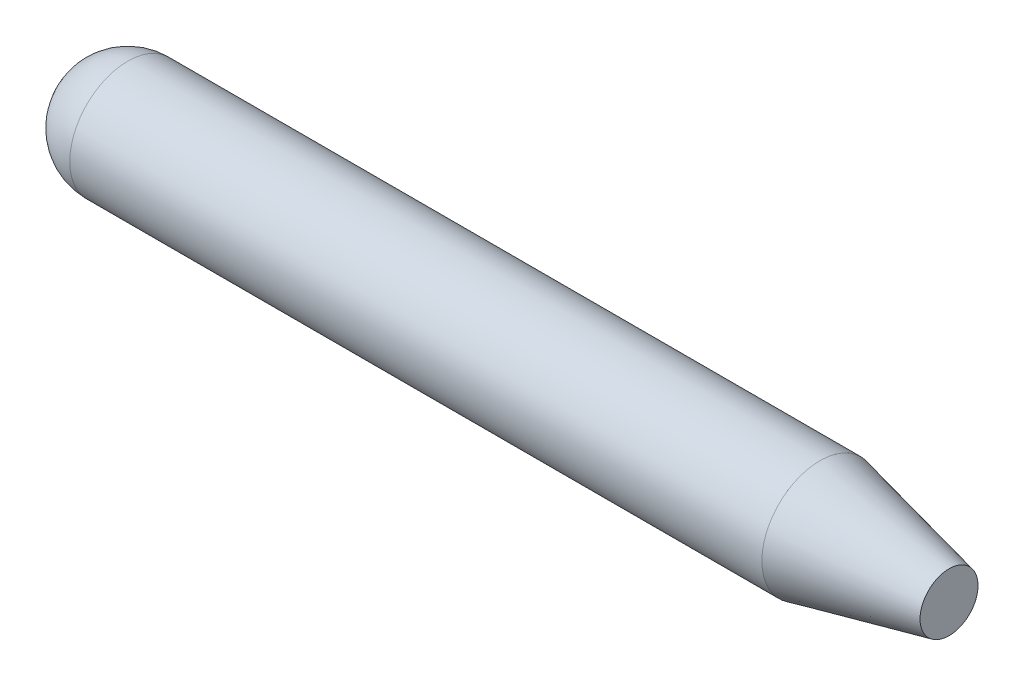
ISO-10303-21;
HEADER;
FILE_DESCRIPTION(('STEP AP214'),'2;1');
FILE_NAME('part.step','',(''),(''),'','','');
FILE_SCHEMA(('AUTOMOTIVE_DESIGN { 1 0 10303 214 1 1 1 1 }'));
ENDSEC;
DATA;
#1=APPLICATION_CONTEXT('core data for automotive mechanical design processes');
#2=APPLICATION_PROTOCOL_DEFINITION('international standard','automotive_design',2000,#1);
#3=PRODUCT_CONTEXT('',#1,'mechanical');
#4=PRODUCT('Part','Part','',(#3));
#5=PRODUCT_RELATED_PRODUCT_CATEGORY('part','',(#4));
#6=PRODUCT_DEFINITION_FORMATION('','',#4);
#7=PRODUCT_DEFINITION_CONTEXT('part definition',#1,'design');
#8=PRODUCT_DEFINITION('design','',#6,#7);
#9=PRODUCT_DEFINITION_SHAPE('','',#8);
#10=(LENGTH_UNIT() NAMED_UNIT(*) SI_UNIT(.MILLI.,.METRE.));
#11=(NAMED_UNIT(*) PLANE_ANGLE_UNIT() SI_UNIT($,.RADIAN.));
#12=(NAMED_UNIT(*) SI_UNIT($,.STERADIAN.) SOLID_ANGLE_UNIT());
#13=UNCERTAINTY_MEASURE_WITH_UNIT(LENGTH_MEASURE(1.E-05),#10,'distance_accuracy_value','');
#14=(GEOMETRIC_REPRESENTATION_CONTEXT(3) GLOBAL_UNCERTAINTY_ASSIGNED_CONTEXT((#13)) GLOBAL_UNIT_ASSIGNED_CONTEXT((#10,
#11,#12)) REPRESENTATION_CONTEXT('',''));
#15=CARTESIAN_POINT('',(0.,0.,0.));
#16=DIRECTION('',(0.,0.,1.));
#17=DIRECTION('',(1.,0.,0.));
#18=AXIS2_PLACEMENT_3D('',#15,#16,#17);
#19=CARTESIAN_POINT('',(68.58,0.,0.));
#20=DIRECTION('',(-1.,0.,0.));
#21=DIRECTION('',(0.,1.,0.));
#22=AXIS2_PLACEMENT_3D('',#19,#20,#21);
#23=SPHERICAL_SURFACE('',#22,68.58);
#24=CARTESIAN_POINT('',(68.58,0.,0.));
#25=DIRECTION('',(-1.,0.,0.));
#26=DIRECTION('',(0.,0.,1.));
#27=AXIS2_PLACEMENT_3D('',#24,#25,#26);
#28=CIRCLE('',#27,68.58);
#29=CARTESIAN_POINT('',(68.58,0.,68.58));
#30=VERTEX_POINT('',#29);
#31=EDGE_CURVE('E51',#30,#30,#28,.T.);
#32=ORIENTED_EDGE('',*,*,#31,.T.);
#33=EDGE_LOOP('',(#32));
#34=FACE_BOUND('',#33,.T.);
#35=ADVANCED_FACE('F39',(#34),#23,.T.);
#36=CARTESIAN_POINT('',(1040.2751997877,34.3254035238339,0.));
#37=DIRECTION('',(-1.,0.,0.));
#38=DIRECTION('',(0.,0.,1.));
#39=AXIS2_PLACEMENT_3D('',#36,#37,#38);
#40=PLANE('',#39);
#41=CARTESIAN_POINT('',(1040.2751997877,0.,0.));
#42=DIRECTION('',(-1.,0.,0.));
#43=DIRECTION('',(0.,0.,1.));
#44=AXIS2_PLACEMENT_3D('',#41,#42,#43);
#45=CIRCLE('',#44,34.3254035238339);
#46=CARTESIAN_POINT('',(1040.2751997877,0.,34.3254035238339));
#47=VERTEX_POINT('',#46);
#48=EDGE_CURVE('E10',#47,#47,#45,.T.);
#49=ORIENTED_EDGE('',*,*,#48,.F.);
#50=EDGE_LOOP('',(#49));
#51=FACE_BOUND('',#50,.T.);
#52=ADVANCED_FACE('F67',(#51),#40,.F.);
#53=CARTESIAN_POINT('',(1040.2751997877,0.,0.));
#54=DIRECTION('',(-1.,0.,0.));
#55=DIRECTION('',(0.,0.,1.));
#56=AXIS2_PLACEMENT_3D('',#53,#54,#55);
#57=CONICAL_SURFACE('',#56,34.3254035238339,0.220439024132309);
#58=CARTESIAN_POINT('',(887.407793025499,0.,0.));
#59=DIRECTION('',(-1.,0.,0.));
#60=DIRECTION('',(0.,0.,1.));
#61=AXIS2_PLACEMENT_3D('',#58,#59,#60);
#62=CIRCLE('',#61,68.58);
#63=CARTESIAN_POINT('',(887.407793025499,0.,68.58));
#64=VERTEX_POINT('',#63);
#65=EDGE_CURVE('E46',#64,#64,#62,.T.);
#66=ORIENTED_EDGE('',*,*,#65,.F.);
#67=EDGE_LOOP('',(#66));
#68=FACE_BOUND('',#67,.T.);
#69=ORIENTED_EDGE('',*,*,#48,.T.);
#70=EDGE_LOOP('',(#69));
#71=FACE_BOUND('',#70,.T.);
#72=ADVANCED_FACE('F62',(#68,#71),#57,.T.);
#73=CARTESIAN_POINT('',(0.,0.,0.));
#74=DIRECTION('',(-1.,0.,0.));
#75=DIRECTION('',(0.,0.,1.));
#76=AXIS2_PLACEMENT_3D('',#73,#74,#75);
#77=CYLINDRICAL_SURFACE('',#76,68.58);
#78=ORIENTED_EDGE('',*,*,#31,.F.);
#79=EDGE_LOOP('',(#78));
#80=FACE_BOUND('',#79,.T.);
#81=ORIENTED_EDGE('',*,*,#65,.T.);
#82=EDGE_LOOP('',(#81));
#83=FACE_BOUND('',#82,.T.);
#84=ADVANCED_FACE('F60',(#80,#83),#77,.T.);
#85=CLOSED_SHELL('',(#35,#52,#72,#84));
#86=MANIFOLD_SOLID_BREP('B2',#85);
#87=ADVANCED_BREP_SHAPE_REPRESENTATION('',(#18,#86),#14);
#88=SHAPE_DEFINITION_REPRESENTATION(#9,#87);
ENDSEC;
END-ISO-10303-21;
